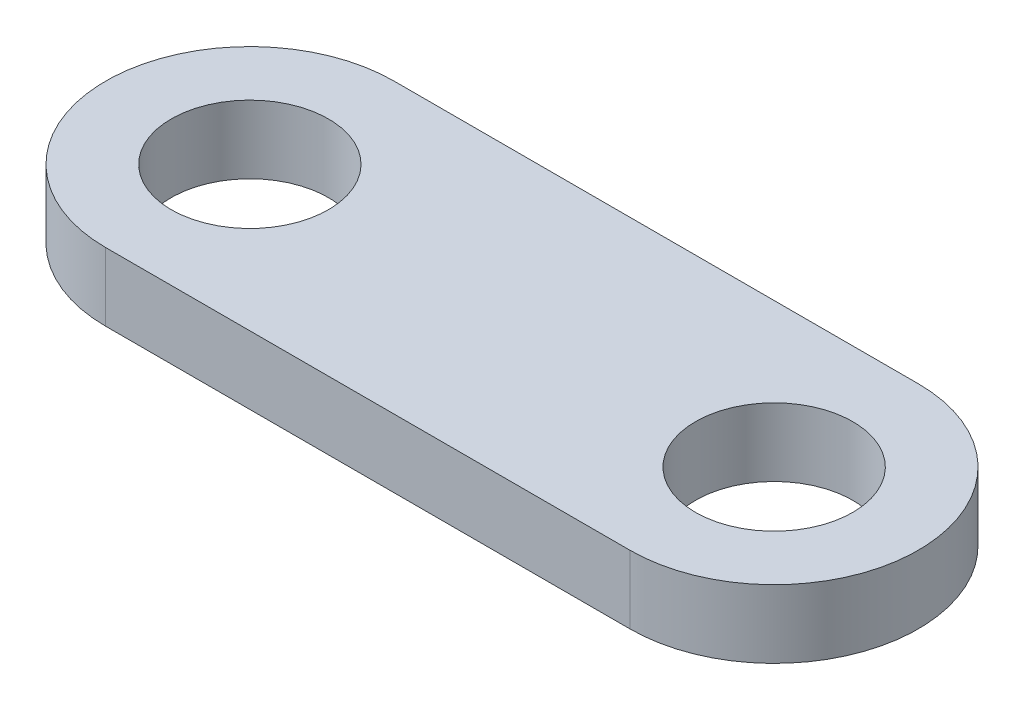
ISO-10303-21;
HEADER;
FILE_DESCRIPTION(('STEP AP214'),'2;1');
FILE_NAME('part.step','',(''),(''),'','','');
FILE_SCHEMA(('AUTOMOTIVE_DESIGN { 1 0 10303 214 1 1 1 1 }'));
ENDSEC;
DATA;
#1=APPLICATION_CONTEXT('core data for automotive mechanical design processes');
#2=APPLICATION_PROTOCOL_DEFINITION('international standard','automotive_design',2000,#1);
#3=PRODUCT_CONTEXT('',#1,'mechanical');
#4=PRODUCT('Part','Part','',(#3));
#5=PRODUCT_RELATED_PRODUCT_CATEGORY('part','',(#4));
#6=PRODUCT_DEFINITION_FORMATION('','',#4);
#7=PRODUCT_DEFINITION_CONTEXT('part definition',#1,'design');
#8=PRODUCT_DEFINITION('design','',#6,#7);
#9=PRODUCT_DEFINITION_SHAPE('','',#8);
#10=(LENGTH_UNIT() NAMED_UNIT(*) SI_UNIT(.MILLI.,.METRE.));
#11=(NAMED_UNIT(*) PLANE_ANGLE_UNIT() SI_UNIT($,.RADIAN.));
#12=(NAMED_UNIT(*) SI_UNIT($,.STERADIAN.) SOLID_ANGLE_UNIT());
#13=UNCERTAINTY_MEASURE_WITH_UNIT(LENGTH_MEASURE(1.E-05),#10,'distance_accuracy_value','');
#14=(GEOMETRIC_REPRESENTATION_CONTEXT(3) GLOBAL_UNCERTAINTY_ASSIGNED_CONTEXT((#13)) GLOBAL_UNIT_ASSIGNED_CONTEXT((#10,
#11,#12)) REPRESENTATION_CONTEXT('',''));
#15=CARTESIAN_POINT('',(0.,0.,0.));
#16=DIRECTION('',(0.,0.,1.));
#17=DIRECTION('',(1.,0.,0.));
#18=AXIS2_PLACEMENT_3D('',#15,#16,#17);
#19=CARTESIAN_POINT('',(-10.,2.6,0.));
#20=DIRECTION('',(0.,1.,0.));
#21=DIRECTION('',(0.,0.,1.));
#22=AXIS2_PLACEMENT_3D('',#19,#20,#21);
#23=PLANE('',#22);
#24=CARTESIAN_POINT('',(-10.,2.6,0.));
#25=DIRECTION('',(0.,1.,0.));
#26=DIRECTION('',(0.,0.,1.));
#27=AXIS2_PLACEMENT_3D('',#24,#25,#26);
#28=CIRCLE('',#27,3.);
#29=CARTESIAN_POINT('',(-10.,2.6,3.));
#30=VERTEX_POINT('',#29);
#31=EDGE_CURVE('E116',#30,#30,#28,.T.);
#32=ORIENTED_EDGE('',*,*,#31,.F.);
#33=EDGE_LOOP('',(#32));
#34=FACE_BOUND('',#33,.T.);
#35=CARTESIAN_POINT('',(-10.,2.6,0.));
#36=DIRECTION('',(0.,1.,0.));
#37=DIRECTION('',(0.,0.,1.));
#38=AXIS2_PLACEMENT_3D('',#35,#36,#37);
#39=CIRCLE('',#38,5.5);
#40=CARTESIAN_POINT('',(-10.,2.6,-5.5));
#41=VERTEX_POINT('',#40);
#42=CARTESIAN_POINT('',(-10.,2.6,5.5));
#43=VERTEX_POINT('',#42);
#44=EDGE_CURVE('E96',#41,#43,#39,.T.);
#45=ORIENTED_EDGE('',*,*,#44,.T.);
#46=DIRECTION('',(1.,0.,0.));
#47=VECTOR('',#46,1.);
#48=CARTESIAN_POINT('',(-10.,2.6,5.5));
#49=LINE('',#48,#47);
#50=CARTESIAN_POINT('',(10.,2.6,5.5));
#51=VERTEX_POINT('',#50);
#52=EDGE_CURVE('E91',#43,#51,#49,.T.);
#53=ORIENTED_EDGE('',*,*,#52,.T.);
#54=CARTESIAN_POINT('',(10.,2.6,0.));
#55=DIRECTION('',(0.,1.,0.));
#56=DIRECTION('',(0.,0.,1.));
#57=AXIS2_PLACEMENT_3D('',#54,#55,#56);
#58=CIRCLE('',#57,5.5);
#59=CARTESIAN_POINT('',(10.,2.6,-5.5));
#60=VERTEX_POINT('',#59);
#61=EDGE_CURVE('E94',#51,#60,#58,.T.);
#62=ORIENTED_EDGE('',*,*,#61,.T.);
#63=DIRECTION('',(-1.,0.,0.));
#64=VECTOR('',#63,1.);
#65=CARTESIAN_POINT('',(-10.,2.6,-5.5));
#66=LINE('',#65,#64);
#67=EDGE_CURVE('E61',#60,#41,#66,.T.);
#68=ORIENTED_EDGE('',*,*,#67,.T.);
#69=EDGE_LOOP('',(#45,#53,#62,#68));
#70=FACE_BOUND('',#69,.T.);
#71=CARTESIAN_POINT('',(10.,2.6,0.));
#72=DIRECTION('',(0.,1.,0.));
#73=DIRECTION('',(0.,0.,1.));
#74=AXIS2_PLACEMENT_3D('',#71,#72,#73);
#75=CIRCLE('',#74,3.);
#76=CARTESIAN_POINT('',(10.,2.6,3.));
#77=VERTEX_POINT('',#76);
#78=EDGE_CURVE('E138',#77,#77,#75,.T.);
#79=ORIENTED_EDGE('',*,*,#78,.F.);
#80=EDGE_LOOP('',(#79));
#81=FACE_BOUND('',#80,.T.);
#82=ADVANCED_FACE('F43',(#34,#70,#81),#23,.T.);
#83=CARTESIAN_POINT('',(-10.,0.,0.));
#84=DIRECTION('',(0.,1.,0.));
#85=DIRECTION('',(0.,0.,1.));
#86=AXIS2_PLACEMENT_3D('',#83,#84,#85);
#87=PLANE('',#86);
#88=CARTESIAN_POINT('',(-10.,0.,0.));
#89=DIRECTION('',(0.,1.,0.));
#90=DIRECTION('',(0.,0.,1.));
#91=AXIS2_PLACEMENT_3D('',#88,#89,#90);
#92=CIRCLE('',#91,5.5);
#93=CARTESIAN_POINT('',(-10.,0.,-5.5));
#94=VERTEX_POINT('',#93);
#95=CARTESIAN_POINT('',(-10.,0.,5.5));
#96=VERTEX_POINT('',#95);
#97=EDGE_CURVE('E112',#94,#96,#92,.T.);
#98=ORIENTED_EDGE('',*,*,#97,.F.);
#99=DIRECTION('',(-1.,0.,0.));
#100=VECTOR('',#99,1.);
#101=CARTESIAN_POINT('',(-10.,0.,-5.5));
#102=LINE('',#101,#100);
#103=CARTESIAN_POINT('',(10.,0.,-5.5));
#104=VERTEX_POINT('',#103);
#105=EDGE_CURVE('E84',#104,#94,#102,.T.);
#106=ORIENTED_EDGE('',*,*,#105,.F.);
#107=CARTESIAN_POINT('',(10.,0.,0.));
#108=DIRECTION('',(0.,1.,0.));
#109=DIRECTION('',(0.,0.,1.));
#110=AXIS2_PLACEMENT_3D('',#107,#108,#109);
#111=CIRCLE('',#110,5.5);
#112=CARTESIAN_POINT('',(10.,0.,5.5));
#113=VERTEX_POINT('',#112);
#114=EDGE_CURVE('E78',#113,#104,#111,.T.);
#115=ORIENTED_EDGE('',*,*,#114,.F.);
#116=DIRECTION('',(1.,0.,0.));
#117=VECTOR('',#116,1.);
#118=CARTESIAN_POINT('',(-10.,0.,5.5));
#119=LINE('',#118,#117);
#120=EDGE_CURVE('E101',#96,#113,#119,.T.);
#121=ORIENTED_EDGE('',*,*,#120,.F.);
#122=EDGE_LOOP('',(#98,#106,#115,#121));
#123=FACE_BOUND('',#122,.T.);
#124=CARTESIAN_POINT('',(-10.,0.,0.));
#125=DIRECTION('',(0.,1.,0.));
#126=DIRECTION('',(0.,0.,1.));
#127=AXIS2_PLACEMENT_3D('',#124,#125,#126);
#128=CIRCLE('',#127,3.);
#129=CARTESIAN_POINT('',(-10.,0.,3.));
#130=VERTEX_POINT('',#129);
#131=EDGE_CURVE('E134',#130,#130,#128,.T.);
#132=ORIENTED_EDGE('',*,*,#131,.T.);
#133=EDGE_LOOP('',(#132));
#134=FACE_BOUND('',#133,.T.);
#135=CARTESIAN_POINT('',(10.,0.,0.));
#136=DIRECTION('',(0.,1.,0.));
#137=DIRECTION('',(0.,0.,1.));
#138=AXIS2_PLACEMENT_3D('',#135,#136,#137);
#139=CIRCLE('',#138,3.);
#140=CARTESIAN_POINT('',(10.,0.,3.));
#141=VERTEX_POINT('',#140);
#142=EDGE_CURVE('E142',#141,#141,#139,.T.);
#143=ORIENTED_EDGE('',*,*,#142,.T.);
#144=EDGE_LOOP('',(#143));
#145=FACE_BOUND('',#144,.T.);
#146=ADVANCED_FACE('F129',(#123,#134,#145),#87,.F.);
#147=CARTESIAN_POINT('',(-10.,2.6,0.));
#148=DIRECTION('',(0.,-1.,0.));
#149=DIRECTION('',(0.,0.,-1.));
#150=AXIS2_PLACEMENT_3D('',#147,#148,#149);
#151=CYLINDRICAL_SURFACE('',#150,5.5);
#152=ORIENTED_EDGE('',*,*,#97,.T.);
#153=DIRECTION('',(0.,-1.,0.));
#154=VECTOR('',#153,1.);
#155=CARTESIAN_POINT('',(-10.,2.6,5.5));
#156=LINE('',#155,#154);
#157=EDGE_CURVE('E11',#43,#96,#156,.T.);
#158=ORIENTED_EDGE('',*,*,#157,.F.);
#159=ORIENTED_EDGE('',*,*,#44,.F.);
#160=DIRECTION('',(0.,-1.,0.));
#161=VECTOR('',#160,1.);
#162=CARTESIAN_POINT('',(-10.,2.6,-5.5));
#163=LINE('',#162,#161);
#164=EDGE_CURVE('E108',#41,#94,#163,.T.);
#165=ORIENTED_EDGE('',*,*,#164,.T.);
#166=EDGE_LOOP('',(#152,#158,#159,#165));
#167=FACE_BOUND('',#166,.T.);
#168=ADVANCED_FACE('F45',(#167),#151,.T.);
#169=CARTESIAN_POINT('',(-10.,2.6,5.5));
#170=DIRECTION('',(0.,0.,-1.));
#171=DIRECTION('',(-1.,0.,0.));
#172=AXIS2_PLACEMENT_3D('',#169,#170,#171);
#173=PLANE('',#172);
#174=ORIENTED_EDGE('',*,*,#120,.T.);
#175=DIRECTION('',(0.,-1.,0.));
#176=VECTOR('',#175,1.);
#177=CARTESIAN_POINT('',(10.,2.6,5.5));
#178=LINE('',#177,#176);
#179=EDGE_CURVE('E53',#51,#113,#178,.T.);
#180=ORIENTED_EDGE('',*,*,#179,.F.);
#181=ORIENTED_EDGE('',*,*,#52,.F.);
#182=ORIENTED_EDGE('',*,*,#157,.T.);
#183=EDGE_LOOP('',(#174,#180,#181,#182));
#184=FACE_BOUND('',#183,.T.);
#185=ADVANCED_FACE('F100',(#184),#173,.F.);
#186=CARTESIAN_POINT('',(10.,2.6,0.));
#187=DIRECTION('',(0.,-1.,0.));
#188=DIRECTION('',(0.,0.,-1.));
#189=AXIS2_PLACEMENT_3D('',#186,#187,#188);
#190=CYLINDRICAL_SURFACE('',#189,5.5);
#191=ORIENTED_EDGE('',*,*,#114,.T.);
#192=DIRECTION('',(0.,-1.,0.));
#193=VECTOR('',#192,1.);
#194=CARTESIAN_POINT('',(10.,2.6,-5.5));
#195=LINE('',#194,#193);
#196=EDGE_CURVE('E103',#60,#104,#195,.T.);
#197=ORIENTED_EDGE('',*,*,#196,.F.);
#198=ORIENTED_EDGE('',*,*,#61,.F.);
#199=ORIENTED_EDGE('',*,*,#179,.T.);
#200=EDGE_LOOP('',(#191,#197,#198,#199));
#201=FACE_BOUND('',#200,.T.);
#202=ADVANCED_FACE('F104',(#201),#190,.T.);
#203=CARTESIAN_POINT('',(-10.,2.6,-5.5));
#204=DIRECTION('',(0.,0.,1.));
#205=DIRECTION('',(1.,0.,0.));
#206=AXIS2_PLACEMENT_3D('',#203,#204,#205);
#207=PLANE('',#206);
#208=ORIENTED_EDGE('',*,*,#105,.T.);
#209=ORIENTED_EDGE('',*,*,#164,.F.);
#210=ORIENTED_EDGE('',*,*,#67,.F.);
#211=ORIENTED_EDGE('',*,*,#196,.T.);
#212=EDGE_LOOP('',(#208,#209,#210,#211));
#213=FACE_BOUND('',#212,.T.);
#214=ADVANCED_FACE('F126',(#213),#207,.F.);
#215=CARTESIAN_POINT('',(-10.,2.6,0.));
#216=DIRECTION('',(0.,-1.,0.));
#217=DIRECTION('',(0.,0.,-1.));
#218=AXIS2_PLACEMENT_3D('',#215,#216,#217);
#219=CYLINDRICAL_SURFACE('',#218,3.);
#220=ORIENTED_EDGE('',*,*,#31,.T.);
#221=EDGE_LOOP('',(#220));
#222=FACE_BOUND('',#221,.T.);
#223=ORIENTED_EDGE('',*,*,#131,.F.);
#224=EDGE_LOOP('',(#223));
#225=FACE_BOUND('',#224,.T.);
#226=ADVANCED_FACE('F161',(#222,#225),#219,.F.);
#227=CARTESIAN_POINT('',(10.,2.6,0.));
#228=DIRECTION('',(0.,-1.,0.));
#229=DIRECTION('',(0.,0.,-1.));
#230=AXIS2_PLACEMENT_3D('',#227,#228,#229);
#231=CYLINDRICAL_SURFACE('',#230,3.);
#232=ORIENTED_EDGE('',*,*,#78,.T.);
#233=EDGE_LOOP('',(#232));
#234=FACE_BOUND('',#233,.T.);
#235=ORIENTED_EDGE('',*,*,#142,.F.);
#236=EDGE_LOOP('',(#235));
#237=FACE_BOUND('',#236,.T.);
#238=ADVANCED_FACE('F150',(#234,#237),#231,.F.);
#239=CLOSED_SHELL('',(#82,#146,#168,#185,#202,#214,#226,#238));
#240=MANIFOLD_SOLID_BREP('B2',#239);
#241=ADVANCED_BREP_SHAPE_REPRESENTATION('',(#18,#240),#14);
#242=SHAPE_DEFINITION_REPRESENTATION(#9,#241);
ENDSEC;
END-ISO-10303-21;
